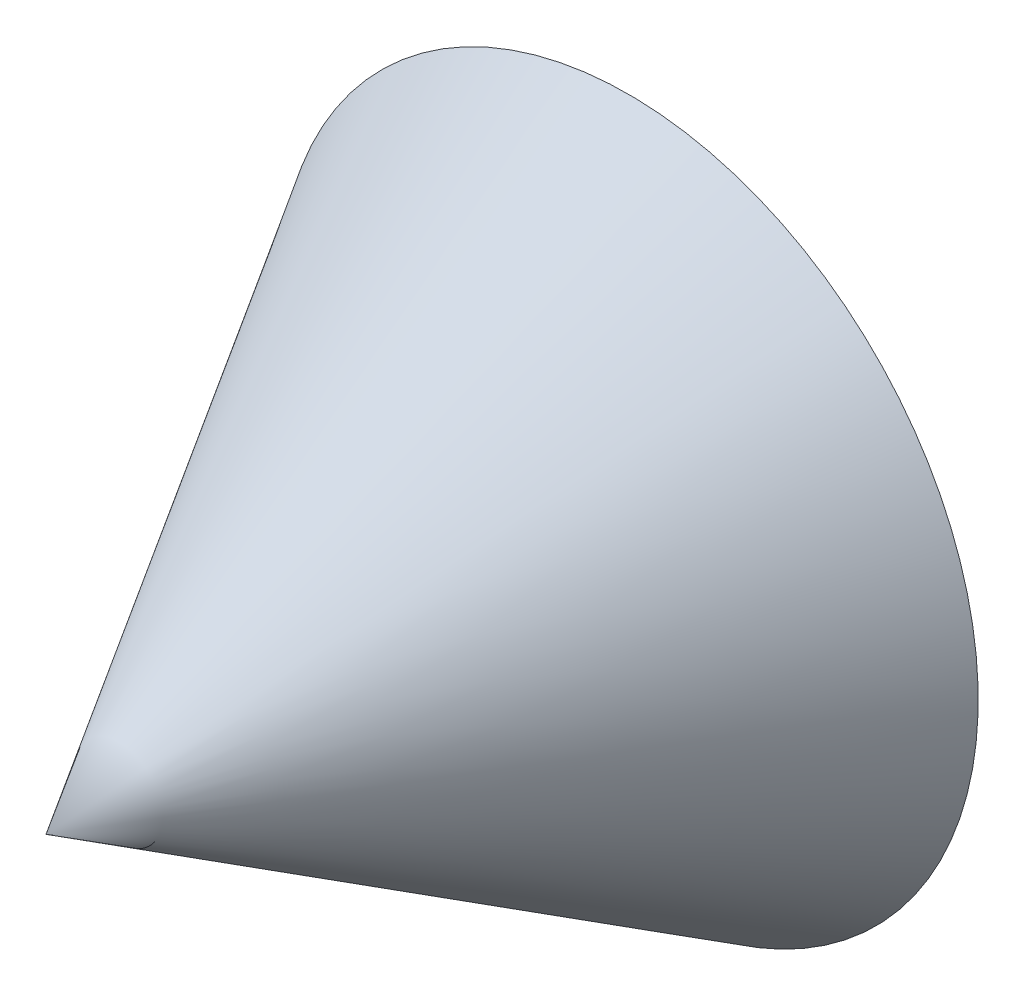
ISO-10303-21;
HEADER;
FILE_DESCRIPTION(('STEP AP214'),'2;1');
FILE_NAME('part.step','',(''),(''),'','','');
FILE_SCHEMA(('AUTOMOTIVE_DESIGN { 1 0 10303 214 1 1 1 1 }'));
ENDSEC;
DATA;
#1=APPLICATION_CONTEXT('core data for automotive mechanical design processes');
#2=APPLICATION_PROTOCOL_DEFINITION('international standard','automotive_design',2000,#1);
#3=PRODUCT_CONTEXT('',#1,'mechanical');
#4=PRODUCT('Part','Part','',(#3));
#5=PRODUCT_RELATED_PRODUCT_CATEGORY('part','',(#4));
#6=PRODUCT_DEFINITION_FORMATION('','',#4);
#7=PRODUCT_DEFINITION_CONTEXT('part definition',#1,'design');
#8=PRODUCT_DEFINITION('design','',#6,#7);
#9=PRODUCT_DEFINITION_SHAPE('','',#8);
#10=(LENGTH_UNIT() NAMED_UNIT(*) SI_UNIT(.MILLI.,.METRE.));
#11=(NAMED_UNIT(*) PLANE_ANGLE_UNIT() SI_UNIT($,.RADIAN.));
#12=(NAMED_UNIT(*) SI_UNIT($,.STERADIAN.) SOLID_ANGLE_UNIT());
#13=UNCERTAINTY_MEASURE_WITH_UNIT(LENGTH_MEASURE(1.E-05),#10,'distance_accuracy_value','');
#14=(GEOMETRIC_REPRESENTATION_CONTEXT(3) GLOBAL_UNCERTAINTY_ASSIGNED_CONTEXT((#13)) GLOBAL_UNIT_ASSIGNED_CONTEXT((#10,
#11,#12)) REPRESENTATION_CONTEXT('',''));
#15=CARTESIAN_POINT('',(0.,0.,0.));
#16=DIRECTION('',(0.,0.,1.));
#17=DIRECTION('',(1.,0.,0.));
#18=AXIS2_PLACEMENT_3D('',#15,#16,#17);
#19=CARTESIAN_POINT('',(0.,0.,0.));
#20=DIRECTION('',(0.,0.,-1.));
#21=DIRECTION('',(-1.,0.,0.));
#22=AXIS2_PLACEMENT_3D('',#19,#20,#21);
#23=PLANE('',#22);
#24=CARTESIAN_POINT('',(0.,0.,0.));
#25=DIRECTION('',(0.,0.,-1.));
#26=DIRECTION('',(-1.,0.,0.));
#27=AXIS2_PLACEMENT_3D('',#24,#25,#26);
#28=CIRCLE('',#27,6.);
#29=CARTESIAN_POINT('',(-6.,0.,0.));
#30=VERTEX_POINT('',#29);
#31=EDGE_CURVE('E11',#30,#30,#28,.T.);
#32=ORIENTED_EDGE('',*,*,#31,.T.);
#33=EDGE_LOOP('',(#32));
#34=FACE_BOUND('',#33,.T.);
#35=ADVANCED_FACE('F43',(#34),#23,.T.);
#36=CARTESIAN_POINT('',(0.,0.,0.));
#37=DIRECTION('',(0.,0.,-1.));
#38=DIRECTION('',(-1.,0.,0.));
#39=AXIS2_PLACEMENT_3D('',#36,#37,#38);
#40=CONICAL_SURFACE('',#39,6.,0.540419500270584);
#41=CARTESIAN_POINT('',(0.,0.,10.));
#42=VERTEX_POINT('',#41);
#43=VERTEX_LOOP('',#42);
#44=FACE_BOUND('',#43,.T.);
#45=ORIENTED_EDGE('',*,*,#31,.F.);
#46=EDGE_LOOP('',(#45));
#47=FACE_BOUND('',#46,.T.);
#48=ADVANCED_FACE('F50',(#44,#47),#40,.T.);
#49=CLOSED_SHELL('',(#35,#48));
#50=MANIFOLD_SOLID_BREP('B2',#49);
#51=ADVANCED_BREP_SHAPE_REPRESENTATION('',(#18,#50),#14);
#52=SHAPE_DEFINITION_REPRESENTATION(#9,#51);
ENDSEC;
END-ISO-10303-21;
